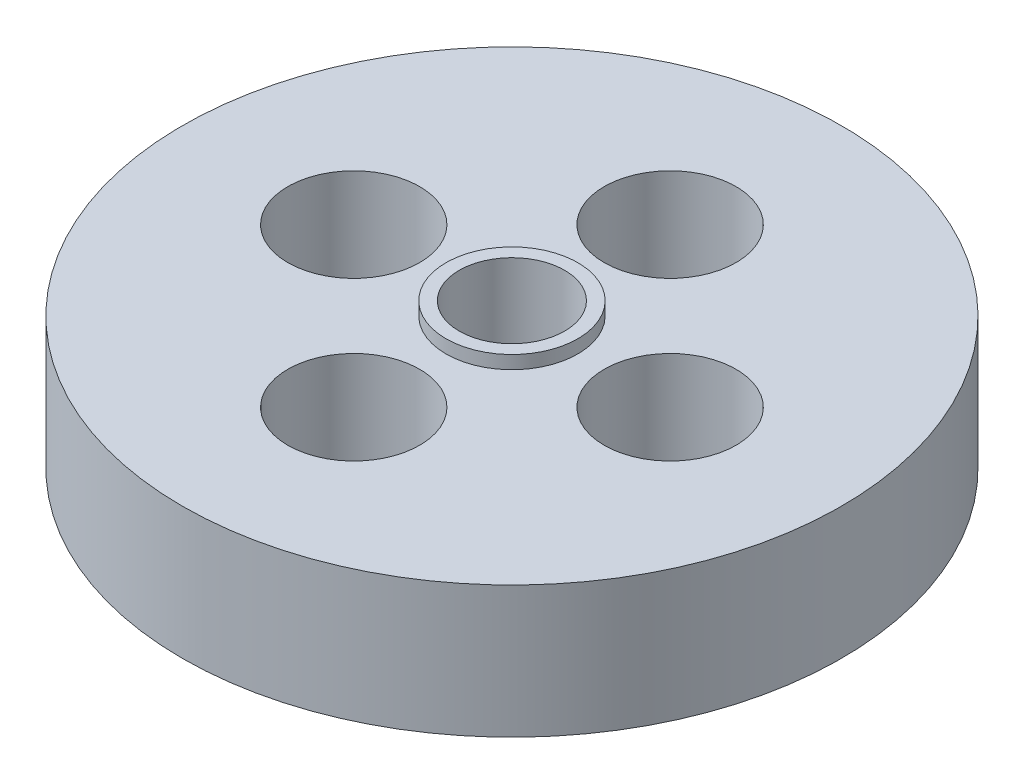
ISO-10303-21;
HEADER;
FILE_DESCRIPTION(('STEP AP214'),'2;1');
FILE_NAME('part.step','',(''),(''),'','','');
FILE_SCHEMA(('AUTOMOTIVE_DESIGN { 1 0 10303 214 1 1 1 1 }'));
ENDSEC;
DATA;
#1=APPLICATION_CONTEXT('core data for automotive mechanical design processes');
#2=APPLICATION_PROTOCOL_DEFINITION('international standard','automotive_design',2000,#1);
#3=PRODUCT_CONTEXT('',#1,'mechanical');
#4=PRODUCT('Part','Part','',(#3));
#5=PRODUCT_RELATED_PRODUCT_CATEGORY('part','',(#4));
#6=PRODUCT_DEFINITION_FORMATION('','',#4);
#7=PRODUCT_DEFINITION_CONTEXT('part definition',#1,'design');
#8=PRODUCT_DEFINITION('design','',#6,#7);
#9=PRODUCT_DEFINITION_SHAPE('','',#8);
#10=(LENGTH_UNIT() NAMED_UNIT(*) SI_UNIT(.MILLI.,.METRE.));
#11=(NAMED_UNIT(*) PLANE_ANGLE_UNIT() SI_UNIT($,.RADIAN.));
#12=(NAMED_UNIT(*) SI_UNIT($,.STERADIAN.) SOLID_ANGLE_UNIT());
#13=UNCERTAINTY_MEASURE_WITH_UNIT(LENGTH_MEASURE(1.E-05),#10,'distance_accuracy_value','');
#14=(GEOMETRIC_REPRESENTATION_CONTEXT(3) GLOBAL_UNCERTAINTY_ASSIGNED_CONTEXT((#13)) GLOBAL_UNIT_ASSIGNED_CONTEXT((#10,
#11,#12)) REPRESENTATION_CONTEXT('',''));
#15=CARTESIAN_POINT('',(0.,0.,0.));
#16=DIRECTION('',(0.,0.,1.));
#17=DIRECTION('',(1.,0.,0.));
#18=AXIS2_PLACEMENT_3D('',#15,#16,#17);
#19=CARTESIAN_POINT('',(0.,10.,0.));
#20=DIRECTION('',(0.,-1.,0.));
#21=DIRECTION('',(0.,0.,-1.));
#22=AXIS2_PLACEMENT_3D('',#19,#20,#21);
#23=CYLINDRICAL_SURFACE('',#22,25.);
#24=CARTESIAN_POINT('',(0.,10.,0.));
#25=DIRECTION('',(0.,1.,0.));
#26=DIRECTION('',(0.,0.,1.));
#27=AXIS2_PLACEMENT_3D('',#24,#25,#26);
#28=CIRCLE('',#27,25.);
#29=CARTESIAN_POINT('',(0.,10.,25.));
#30=VERTEX_POINT('',#29);
#31=EDGE_CURVE('E10',#30,#30,#28,.T.);
#32=ORIENTED_EDGE('',*,*,#31,.F.);
#33=EDGE_LOOP('',(#32));
#34=FACE_BOUND('',#33,.T.);
#35=CARTESIAN_POINT('',(0.,0.,0.));
#36=DIRECTION('',(0.,1.,0.));
#37=DIRECTION('',(0.,0.,1.));
#38=AXIS2_PLACEMENT_3D('',#35,#36,#37);
#39=CIRCLE('',#38,25.);
#40=CARTESIAN_POINT('',(0.,0.,25.));
#41=VERTEX_POINT('',#40);
#42=EDGE_CURVE('E67',#41,#41,#39,.T.);
#43=ORIENTED_EDGE('',*,*,#42,.T.);
#44=EDGE_LOOP('',(#43));
#45=FACE_BOUND('',#44,.T.);
#46=ADVANCED_FACE('F37',(#34,#45),#23,.T.);
#47=CARTESIAN_POINT('',(0.,10.,-12.));
#48=DIRECTION('',(0.,-1.,0.));
#49=DIRECTION('',(0.,0.,-1.));
#50=AXIS2_PLACEMENT_3D('',#47,#48,#49);
#51=CYLINDRICAL_SURFACE('',#50,5.);
#52=CARTESIAN_POINT('',(0.,10.,-12.));
#53=DIRECTION('',(0.,1.,0.));
#54=DIRECTION('',(0.,0.,1.));
#55=AXIS2_PLACEMENT_3D('',#52,#53,#54);
#56=CIRCLE('',#55,5.);
#57=CARTESIAN_POINT('',(0.,10.,-7.));
#58=VERTEX_POINT('',#57);
#59=EDGE_CURVE('E45',#58,#58,#56,.T.);
#60=ORIENTED_EDGE('',*,*,#59,.T.);
#61=EDGE_LOOP('',(#60));
#62=FACE_BOUND('',#61,.T.);
#63=CARTESIAN_POINT('',(0.,0.,-12.));
#64=DIRECTION('',(0.,1.,0.));
#65=DIRECTION('',(0.,0.,1.));
#66=AXIS2_PLACEMENT_3D('',#63,#64,#65);
#67=CIRCLE('',#66,5.);
#68=CARTESIAN_POINT('',(0.,0.,-7.));
#69=VERTEX_POINT('',#68);
#70=EDGE_CURVE('E64',#69,#69,#67,.T.);
#71=ORIENTED_EDGE('',*,*,#70,.F.);
#72=EDGE_LOOP('',(#71));
#73=FACE_BOUND('',#72,.T.);
#74=ADVANCED_FACE('F99',(#62,#73),#51,.F.);
#75=CARTESIAN_POINT('',(-11.9999999999997,10.,3.4032572508536E-13));
#76=DIRECTION('',(0.,-1.,0.));
#77=DIRECTION('',(0.,0.,-1.));
#78=AXIS2_PLACEMENT_3D('',#75,#76,#77);
#79=CYLINDRICAL_SURFACE('',#78,5.00000000000054);
#80=CARTESIAN_POINT('',(-11.9999999999997,10.,3.4032572508536E-13));
#81=DIRECTION('',(0.,1.,0.));
#82=DIRECTION('',(0.,0.,1.));
#83=AXIS2_PLACEMENT_3D('',#80,#81,#82);
#84=CIRCLE('',#83,5.00000000000054);
#85=CARTESIAN_POINT('',(-11.9999999999997,10.,5.00000000000088));
#86=VERTEX_POINT('',#85);
#87=EDGE_CURVE('E50',#86,#86,#84,.T.);
#88=ORIENTED_EDGE('',*,*,#87,.T.);
#89=EDGE_LOOP('',(#88));
#90=FACE_BOUND('',#89,.T.);
#91=CARTESIAN_POINT('',(-11.9999999999997,0.,3.4032572508536E-13));
#92=DIRECTION('',(0.,1.,0.));
#93=DIRECTION('',(0.,0.,1.));
#94=AXIS2_PLACEMENT_3D('',#91,#92,#93);
#95=CIRCLE('',#94,5.00000000000054);
#96=CARTESIAN_POINT('',(-11.9999999999997,0.,5.00000000000088));
#97=VERTEX_POINT('',#96);
#98=EDGE_CURVE('E61',#97,#97,#95,.T.);
#99=ORIENTED_EDGE('',*,*,#98,.F.);
#100=EDGE_LOOP('',(#99));
#101=FACE_BOUND('',#100,.T.);
#102=ADVANCED_FACE('F87',(#90,#101),#79,.F.);
#103=CARTESIAN_POINT('',(0.,10.,12.));
#104=DIRECTION('',(0.,-1.,0.));
#105=DIRECTION('',(0.,0.,-1.));
#106=AXIS2_PLACEMENT_3D('',#103,#104,#105);
#107=CYLINDRICAL_SURFACE('',#106,5.00000000000012);
#108=CARTESIAN_POINT('',(0.,10.,12.));
#109=DIRECTION('',(0.,1.,0.));
#110=DIRECTION('',(0.,0.,1.));
#111=AXIS2_PLACEMENT_3D('',#108,#109,#110);
#112=CIRCLE('',#111,5.00000000000012);
#113=CARTESIAN_POINT('',(0.,10.,17.0000000000001));
#114=VERTEX_POINT('',#113);
#115=EDGE_CURVE('E75',#114,#114,#112,.T.);
#116=ORIENTED_EDGE('',*,*,#115,.T.);
#117=EDGE_LOOP('',(#116));
#118=FACE_BOUND('',#117,.T.);
#119=CARTESIAN_POINT('',(0.,0.,12.));
#120=DIRECTION('',(0.,1.,0.));
#121=DIRECTION('',(0.,0.,1.));
#122=AXIS2_PLACEMENT_3D('',#119,#120,#121);
#123=CIRCLE('',#122,5.00000000000012);
#124=CARTESIAN_POINT('',(0.,0.,17.0000000000001));
#125=VERTEX_POINT('',#124);
#126=EDGE_CURVE('E57',#125,#125,#123,.T.);
#127=ORIENTED_EDGE('',*,*,#126,.F.);
#128=EDGE_LOOP('',(#127));
#129=FACE_BOUND('',#128,.T.);
#130=ADVANCED_FACE('F120',(#118,#129),#107,.F.);
#131=CARTESIAN_POINT('',(12.,10.,0.));
#132=DIRECTION('',(0.,-1.,0.));
#133=DIRECTION('',(0.,0.,-1.));
#134=AXIS2_PLACEMENT_3D('',#131,#132,#133);
#135=CYLINDRICAL_SURFACE('',#134,5.);
#136=CARTESIAN_POINT('',(12.,10.,0.));
#137=DIRECTION('',(0.,1.,0.));
#138=DIRECTION('',(0.,0.,1.));
#139=AXIS2_PLACEMENT_3D('',#136,#137,#138);
#140=CIRCLE('',#139,5.);
#141=CARTESIAN_POINT('',(12.,10.,5.00000000000004));
#142=VERTEX_POINT('',#141);
#143=EDGE_CURVE('E71',#142,#142,#140,.T.);
#144=ORIENTED_EDGE('',*,*,#143,.T.);
#145=EDGE_LOOP('',(#144));
#146=FACE_BOUND('',#145,.T.);
#147=CARTESIAN_POINT('',(12.,0.,0.));
#148=DIRECTION('',(0.,1.,0.));
#149=DIRECTION('',(0.,0.,1.));
#150=AXIS2_PLACEMENT_3D('',#147,#148,#149);
#151=CIRCLE('',#150,5.);
#152=CARTESIAN_POINT('',(12.,0.,5.00000000000004));
#153=VERTEX_POINT('',#152);
#154=EDGE_CURVE('E54',#153,#153,#151,.T.);
#155=ORIENTED_EDGE('',*,*,#154,.F.);
#156=EDGE_LOOP('',(#155));
#157=FACE_BOUND('',#156,.T.);
#158=ADVANCED_FACE('F39',(#146,#157),#135,.F.);
#159=CARTESIAN_POINT('',(0.,10.,0.));
#160=DIRECTION('',(0.,-1.,0.));
#161=DIRECTION('',(0.,0.,-1.));
#162=AXIS2_PLACEMENT_3D('',#159,#160,#161);
#163=CYLINDRICAL_SURFACE('',#162,4.);
#164=CARTESIAN_POINT('',(0.,0.,0.));
#165=DIRECTION('',(0.,1.,0.));
#166=DIRECTION('',(0.,0.,1.));
#167=AXIS2_PLACEMENT_3D('',#164,#165,#166);
#168=CIRCLE('',#167,4.);
#169=CARTESIAN_POINT('',(0.,0.,4.));
#170=VERTEX_POINT('',#169);
#171=EDGE_CURVE('E69',#170,#170,#168,.T.);
#172=ORIENTED_EDGE('',*,*,#171,.F.);
#173=EDGE_LOOP('',(#172));
#174=FACE_BOUND('',#173,.T.);
#175=CARTESIAN_POINT('',(0.,11.,0.));
#176=DIRECTION('',(0.,1.,0.));
#177=DIRECTION('',(0.,0.,1.));
#178=AXIS2_PLACEMENT_3D('',#175,#176,#177);
#179=CIRCLE('',#178,4.);
#180=CARTESIAN_POINT('',(0.,11.,4.));
#181=VERTEX_POINT('',#180);
#182=EDGE_CURVE('E41',#181,#181,#179,.T.);
#183=ORIENTED_EDGE('',*,*,#182,.T.);
#184=EDGE_LOOP('',(#183));
#185=FACE_BOUND('',#184,.T.);
#186=ADVANCED_FACE('F94',(#174,#185),#163,.F.);
#187=CARTESIAN_POINT('',(0.,10.,0.));
#188=DIRECTION('',(0.,1.,0.));
#189=DIRECTION('',(0.,0.,1.));
#190=AXIS2_PLACEMENT_3D('',#187,#188,#189);
#191=PLANE('',#190);
#192=CARTESIAN_POINT('',(0.,10.,0.));
#193=DIRECTION('',(0.,1.,0.));
#194=DIRECTION('',(0.,0.,1.));
#195=AXIS2_PLACEMENT_3D('',#192,#193,#194);
#196=CIRCLE('',#195,5.);
#197=CARTESIAN_POINT('',(0.,10.,5.));
#198=VERTEX_POINT('',#197);
#199=EDGE_CURVE('E82',#198,#198,#196,.T.);
#200=ORIENTED_EDGE('',*,*,#199,.F.);
#201=EDGE_LOOP('',(#200));
#202=FACE_BOUND('',#201,.T.);
#203=ORIENTED_EDGE('',*,*,#143,.F.);
#204=EDGE_LOOP('',(#203));
#205=FACE_BOUND('',#204,.T.);
#206=ORIENTED_EDGE('',*,*,#115,.F.);
#207=EDGE_LOOP('',(#206));
#208=FACE_BOUND('',#207,.T.);
#209=ORIENTED_EDGE('',*,*,#87,.F.);
#210=EDGE_LOOP('',(#209));
#211=FACE_BOUND('',#210,.T.);
#212=ORIENTED_EDGE('',*,*,#59,.F.);
#213=EDGE_LOOP('',(#212));
#214=FACE_BOUND('',#213,.T.);
#215=ORIENTED_EDGE('',*,*,#31,.T.);
#216=EDGE_LOOP('',(#215));
#217=FACE_BOUND('',#216,.T.);
#218=ADVANCED_FACE('F90',(#202,#205,#208,#211,#214,#217),#191,.T.);
#219=CARTESIAN_POINT('',(0.,0.,0.));
#220=DIRECTION('',(0.,1.,0.));
#221=DIRECTION('',(0.,0.,1.));
#222=AXIS2_PLACEMENT_3D('',#219,#220,#221);
#223=PLANE('',#222);
#224=ORIENTED_EDGE('',*,*,#154,.T.);
#225=EDGE_LOOP('',(#224));
#226=FACE_BOUND('',#225,.T.);
#227=ORIENTED_EDGE('',*,*,#126,.T.);
#228=EDGE_LOOP('',(#227));
#229=FACE_BOUND('',#228,.T.);
#230=ORIENTED_EDGE('',*,*,#98,.T.);
#231=EDGE_LOOP('',(#230));
#232=FACE_BOUND('',#231,.T.);
#233=ORIENTED_EDGE('',*,*,#70,.T.);
#234=EDGE_LOOP('',(#233));
#235=FACE_BOUND('',#234,.T.);
#236=ORIENTED_EDGE('',*,*,#42,.F.);
#237=EDGE_LOOP('',(#236));
#238=FACE_BOUND('',#237,.T.);
#239=ORIENTED_EDGE('',*,*,#171,.T.);
#240=EDGE_LOOP('',(#239));
#241=FACE_BOUND('',#240,.T.);
#242=ADVANCED_FACE('F93',(#226,#229,#232,#235,#238,#241),#223,.F.);
#243=CARTESIAN_POINT('',(0.,11.,0.));
#244=DIRECTION('',(0.,1.,0.));
#245=DIRECTION('',(0.,0.,1.));
#246=AXIS2_PLACEMENT_3D('',#243,#244,#245);
#247=PLANE('',#246);
#248=ORIENTED_EDGE('',*,*,#182,.F.);
#249=EDGE_LOOP('',(#248));
#250=FACE_BOUND('',#249,.T.);
#251=CARTESIAN_POINT('',(0.,11.,0.));
#252=DIRECTION('',(0.,1.,0.));
#253=DIRECTION('',(0.,0.,1.));
#254=AXIS2_PLACEMENT_3D('',#251,#252,#253);
#255=CIRCLE('',#254,5.);
#256=CARTESIAN_POINT('',(0.,11.,5.));
#257=VERTEX_POINT('',#256);
#258=EDGE_CURVE('E58',#257,#257,#255,.T.);
#259=ORIENTED_EDGE('',*,*,#258,.T.);
#260=EDGE_LOOP('',(#259));
#261=FACE_BOUND('',#260,.T.);
#262=ADVANCED_FACE('F107',(#250,#261),#247,.T.);
#263=CARTESIAN_POINT('',(0.,11.,0.));
#264=DIRECTION('',(0.,-1.,0.));
#265=DIRECTION('',(0.,0.,-1.));
#266=AXIS2_PLACEMENT_3D('',#263,#264,#265);
#267=CYLINDRICAL_SURFACE('',#266,5.);
#268=ORIENTED_EDGE('',*,*,#258,.F.);
#269=EDGE_LOOP('',(#268));
#270=FACE_BOUND('',#269,.T.);
#271=ORIENTED_EDGE('',*,*,#199,.T.);
#272=EDGE_LOOP('',(#271));
#273=FACE_BOUND('',#272,.T.);
#274=ADVANCED_FACE('F152',(#270,#273),#267,.T.);
#275=CLOSED_SHELL('',(#46,#74,#102,#130,#158,#186,#218,#242,#262,#274));
#276=MANIFOLD_SOLID_BREP('B2',#275);
#277=ADVANCED_BREP_SHAPE_REPRESENTATION('',(#18,#276),#14);
#278=SHAPE_DEFINITION_REPRESENTATION(#9,#277);
ENDSEC;
END-ISO-10303-21;
